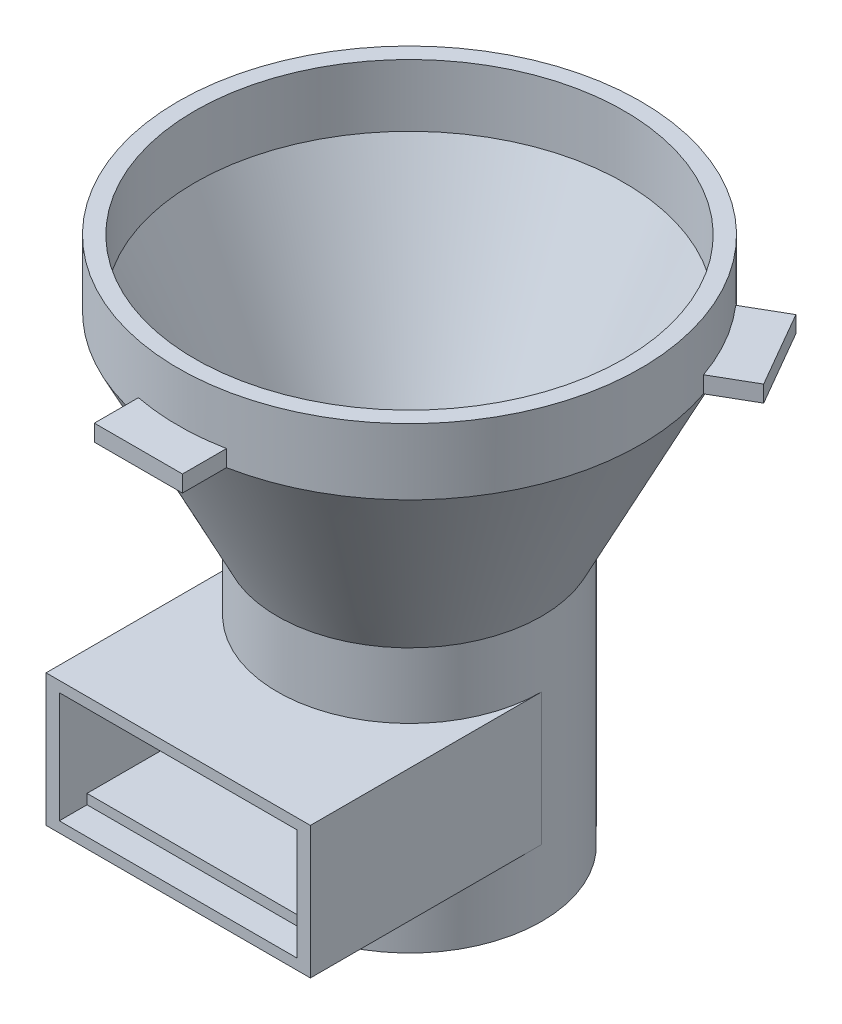
ISO-10303-21;
HEADER;
FILE_DESCRIPTION(('STEP AP214'),'2;1');
FILE_NAME('part.step','',(''),(''),'','','');
FILE_SCHEMA(('AUTOMOTIVE_DESIGN { 1 0 10303 214 1 1 1 1 }'));
ENDSEC;
DATA;
#1=APPLICATION_CONTEXT('core data for automotive mechanical design processes');
#2=APPLICATION_PROTOCOL_DEFINITION('international standard','automotive_design',2000,#1);
#3=PRODUCT_CONTEXT('',#1,'mechanical');
#4=PRODUCT('Part','Part','',(#3));
#5=PRODUCT_RELATED_PRODUCT_CATEGORY('part','',(#4));
#6=PRODUCT_DEFINITION_FORMATION('','',#4);
#7=PRODUCT_DEFINITION_CONTEXT('part definition',#1,'design');
#8=PRODUCT_DEFINITION('design','',#6,#7);
#9=PRODUCT_DEFINITION_SHAPE('','',#8);
#10=(LENGTH_UNIT() NAMED_UNIT(*) SI_UNIT(.MILLI.,.METRE.));
#11=(NAMED_UNIT(*) PLANE_ANGLE_UNIT() SI_UNIT($,.RADIAN.));
#12=(NAMED_UNIT(*) SI_UNIT($,.STERADIAN.) SOLID_ANGLE_UNIT());
#13=UNCERTAINTY_MEASURE_WITH_UNIT(LENGTH_MEASURE(1.E-05),#10,'distance_accuracy_value','');
#14=(GEOMETRIC_REPRESENTATION_CONTEXT(3) GLOBAL_UNCERTAINTY_ASSIGNED_CONTEXT((#13)) GLOBAL_UNIT_ASSIGNED_CONTEXT((#10,
#11,#12)) REPRESENTATION_CONTEXT('',''));
#15=CARTESIAN_POINT('',(0.,0.,0.));
#16=DIRECTION('',(0.,0.,1.));
#17=DIRECTION('',(1.,0.,0.));
#18=AXIS2_PLACEMENT_3D('',#15,#16,#17);
#19=CARTESIAN_POINT('',(0.,92.075,0.));
#20=DIRECTION('',(0.,-1.,0.));
#21=DIRECTION('',(1.,0.,0.));
#22=AXIS2_PLACEMENT_3D('',#19,#20,#21);
#23=PLANE('',#22);
#24=CARTESIAN_POINT('',(0.,92.075,0.));
#25=DIRECTION('',(0.,1.,0.));
#26=DIRECTION('',(-1.,0.,0.));
#27=AXIS2_PLACEMENT_3D('',#24,#25,#26);
#28=CIRCLE('',#27,44.45);
#29=CARTESIAN_POINT('',(-8.46666666666669,92.075,43.6362012044536));
#30=VERTEX_POINT('',#29);
#31=CARTESIAN_POINT('',(8.46666666666665,92.075,43.6362012044536));
#32=VERTEX_POINT('',#31);
#33=EDGE_CURVE('E51',#30,#32,#28,.T.);
#34=ORIENTED_EDGE('',*,*,#33,.F.);
#35=DIRECTION('',(0.,0.,1.));
#36=VECTOR('',#35,1.);
#37=CARTESIAN_POINT('',(-8.46666666666669,92.075,52.1028678711202));
#38=LINE('',#37,#36);
#39=CARTESIAN_POINT('',(-8.46666666666669,92.075,52.1028678711202));
#40=VERTEX_POINT('',#39);
#41=EDGE_CURVE('E205',#30,#40,#38,.T.);
#42=ORIENTED_EDGE('',*,*,#41,.T.);
#43=DIRECTION('',(1.,0.,0.));
#44=VECTOR('',#43,1.);
#45=CARTESIAN_POINT('',(0.,92.075,52.1028678711202));
#46=LINE('',#45,#44);
#47=CARTESIAN_POINT('',(8.46666666666665,92.075,52.1028678711202));
#48=VERTEX_POINT('',#47);
#49=EDGE_CURVE('E223',#40,#48,#46,.T.);
#50=ORIENTED_EDGE('',*,*,#49,.T.);
#51=DIRECTION('',(0.,0.,-1.));
#52=VECTOR('',#51,1.);
#53=CARTESIAN_POINT('',(8.46666666666665,92.075,52.1028678711202));
#54=LINE('',#53,#52);
#55=EDGE_CURVE('E208',#48,#32,#54,.T.);
#56=ORIENTED_EDGE('',*,*,#55,.T.);
#57=EDGE_LOOP('',(#34,#42,#50,#56));
#58=FACE_BOUND('',#57,.T.);
#59=ADVANCED_FACE('F41',(#58),#23,.F.);
#60=CARTESIAN_POINT('',(42.0233921010393,92.075,-14.4857521835181));
#61=VERTEX_POINT('',#60);
#62=CARTESIAN_POINT('',(33.5567254343728,92.075,-29.1504490209347));
#63=VERTEX_POINT('',#62);
#64=EDGE_CURVE('E11',#61,#63,#28,.T.);
#65=ORIENTED_EDGE('',*,*,#64,.F.);
#66=DIRECTION('',(0.866025403784443,0.,-0.499999999999992));
#67=VECTOR('',#66,1.);
#68=CARTESIAN_POINT('',(49.3557405197476,92.075,-18.7190855168514));
#69=LINE('',#68,#67);
#70=CARTESIAN_POINT('',(49.3557405197476,92.075,-18.7190855168514));
#71=VERTEX_POINT('',#70);
#72=EDGE_CURVE('E369',#61,#71,#69,.T.);
#73=ORIENTED_EDGE('',*,*,#72,.T.);
#74=DIRECTION('',(-0.499999999999992,0.,-0.866025403784443));
#75=VECTOR('',#74,1.);
#76=CARTESIAN_POINT('',(45.1224071864144,92.075,-26.0514339355597));
#77=LINE('',#76,#75);
#78=CARTESIAN_POINT('',(40.8890738530811,92.075,-33.383782354268));
#79=VERTEX_POINT('',#78);
#80=EDGE_CURVE('E357',#71,#79,#77,.T.);
#81=ORIENTED_EDGE('',*,*,#80,.T.);
#82=DIRECTION('',(-0.866025403784443,0.,0.499999999999992));
#83=VECTOR('',#82,1.);
#84=CARTESIAN_POINT('',(40.8890738530811,92.075,-33.383782354268));
#85=LINE('',#84,#83);
#86=EDGE_CURVE('E352',#79,#63,#85,.T.);
#87=ORIENTED_EDGE('',*,*,#86,.T.);
#88=EDGE_LOOP('',(#65,#73,#81,#87));
#89=FACE_BOUND('',#88,.T.);
#90=ADVANCED_FACE('F441',(#89),#23,.F.);
#91=CARTESIAN_POINT('',(-33.5567254343724,92.075,-29.1504490209352));
#92=VERTEX_POINT('',#91);
#93=CARTESIAN_POINT('',(-42.0233921010392,92.075,-14.4857521835187));
#94=VERTEX_POINT('',#93);
#95=EDGE_CURVE('E49',#92,#94,#28,.T.);
#96=ORIENTED_EDGE('',*,*,#95,.F.);
#97=DIRECTION('',(-0.866025403784436,0.,-0.500000000000004));
#98=VECTOR('',#97,1.);
#99=CARTESIAN_POINT('',(-40.8890738530807,92.075,-33.3837823542686));
#100=LINE('',#99,#98);
#101=CARTESIAN_POINT('',(-40.8890738530807,92.075,-33.3837823542686));
#102=VERTEX_POINT('',#101);
#103=EDGE_CURVE('E400',#92,#102,#100,.T.);
#104=ORIENTED_EDGE('',*,*,#103,.T.);
#105=DIRECTION('',(-0.500000000000004,0.,0.866025403784436));
#106=VECTOR('',#105,1.);
#107=CARTESIAN_POINT('',(-45.122407186414,92.075,-26.0514339355603));
#108=LINE('',#107,#106);
#109=CARTESIAN_POINT('',(-49.3557405197474,92.075,-18.7190855168521));
#110=VERTEX_POINT('',#109);
#111=EDGE_CURVE('E388',#102,#110,#108,.T.);
#112=ORIENTED_EDGE('',*,*,#111,.T.);
#113=DIRECTION('',(0.866025403784436,0.,0.500000000000004));
#114=VECTOR('',#113,1.);
#115=CARTESIAN_POINT('',(-49.3557405197474,92.075,-18.7190855168521));
#116=LINE('',#115,#114);
#117=EDGE_CURVE('E375',#110,#94,#116,.T.);
#118=ORIENTED_EDGE('',*,*,#117,.T.);
#119=EDGE_LOOP('',(#96,#104,#112,#118));
#120=FACE_BOUND('',#119,.T.);
#121=ADVANCED_FACE('F461',(#120),#23,.F.);
#122=CARTESIAN_POINT('',(22.86,14.8525001339576,3.68300000000003));
#123=DIRECTION('',(1.,0.,0.));
#124=DIRECTION('',(0.,0.,-1.));
#125=AXIS2_PLACEMENT_3D('',#122,#123,#124);
#126=PLANE('',#125);
#127=DIRECTION('',(0.,0.,1.));
#128=VECTOR('',#127,1.);
#129=CARTESIAN_POINT('',(22.86,16.7575001339576,3.68300000000003));
#130=LINE('',#129,#128);
#131=CARTESIAN_POINT('',(22.86,16.7575001339576,3.68300000000003));
#132=VERTEX_POINT('',#131);
#133=CARTESIAN_POINT('',(22.86,16.7575001339576,39.1163527750558));
#134=VERTEX_POINT('',#133);
#135=EDGE_CURVE('E290',#132,#134,#130,.T.);
#136=ORIENTED_EDGE('',*,*,#135,.T.);
#137=DIRECTION('',(0.,1.,0.));
#138=VECTOR('',#137,1.);
#139=CARTESIAN_POINT('',(22.86,16.7575001339576,39.1163527750558));
#140=LINE('',#139,#138);
#141=CARTESIAN_POINT('',(22.86,14.8525001339576,39.1163527750558));
#142=VERTEX_POINT('',#141);
#143=EDGE_CURVE('E278',#142,#134,#140,.T.);
#144=ORIENTED_EDGE('',*,*,#143,.F.);
#145=DIRECTION('',(0.,0.,1.));
#146=VECTOR('',#145,1.);
#147=CARTESIAN_POINT('',(22.86,14.8525001339576,3.68300000000003));
#148=LINE('',#147,#146);
#149=CARTESIAN_POINT('',(22.86,14.8525001339576,44.45));
#150=VERTEX_POINT('',#149);
#151=EDGE_CURVE('E310',#142,#150,#148,.T.);
#152=ORIENTED_EDGE('',*,*,#151,.T.);
#153=DIRECTION('',(0.,1.,0.));
#154=VECTOR('',#153,1.);
#155=CARTESIAN_POINT('',(22.86,14.8525001339576,44.45));
#156=LINE('',#155,#154);
#157=CARTESIAN_POINT('',(22.86,36.1885001339576,44.45));
#158=VERTEX_POINT('',#157);
#159=EDGE_CURVE('E66',#150,#158,#156,.T.);
#160=ORIENTED_EDGE('',*,*,#159,.T.);
#161=DIRECTION('',(0.,0.,1.));
#162=VECTOR('',#161,1.);
#163=CARTESIAN_POINT('',(22.86,36.1885001339576,3.68300000000003));
#164=LINE('',#163,#162);
#165=CARTESIAN_POINT('',(22.86,36.1885001339576,3.68300000000003));
#166=VERTEX_POINT('',#165);
#167=EDGE_CURVE('E300',#166,#158,#164,.T.);
#168=ORIENTED_EDGE('',*,*,#167,.F.);
#169=DIRECTION('',(0.,1.,0.));
#170=VECTOR('',#169,1.);
#171=CARTESIAN_POINT('',(22.86,14.8525001339576,3.68300000000003));
#172=LINE('',#171,#170);
#173=EDGE_CURVE('E292',#132,#166,#172,.T.);
#174=ORIENTED_EDGE('',*,*,#173,.F.);
#175=EDGE_LOOP('',(#136,#144,#152,#160,#168,#174));
#176=FACE_BOUND('',#175,.T.);
#177=ADVANCED_FACE('F466',(#176),#126,.F.);
#178=CARTESIAN_POINT('',(-22.86,14.8525001339576,3.68300000000003));
#179=DIRECTION('',(-1.,0.,0.));
#180=DIRECTION('',(0.,0.,1.));
#181=AXIS2_PLACEMENT_3D('',#178,#179,#180);
#182=PLANE('',#181);
#183=DIRECTION('',(0.,-1.,0.));
#184=VECTOR('',#183,1.);
#185=CARTESIAN_POINT('',(-22.86,16.7575001339576,39.1163527750558));
#186=LINE('',#185,#184);
#187=CARTESIAN_POINT('',(-22.86,16.7575001339576,39.1163527750558));
#188=VERTEX_POINT('',#187);
#189=CARTESIAN_POINT('',(-22.86,14.8525001339576,39.1163527750558));
#190=VERTEX_POINT('',#189);
#191=EDGE_CURVE('E274',#188,#190,#186,.T.);
#192=ORIENTED_EDGE('',*,*,#191,.F.);
#193=DIRECTION('',(0.,0.,-1.));
#194=VECTOR('',#193,1.);
#195=CARTESIAN_POINT('',(-22.86,16.7575001339576,3.68300000000003));
#196=LINE('',#195,#194);
#197=CARTESIAN_POINT('',(-22.86,16.7575001339576,3.68300000000003));
#198=VERTEX_POINT('',#197);
#199=EDGE_CURVE('E287',#188,#198,#196,.T.);
#200=ORIENTED_EDGE('',*,*,#199,.T.);
#201=DIRECTION('',(0.,-1.,0.));
#202=VECTOR('',#201,1.);
#203=CARTESIAN_POINT('',(-22.86,14.8525001339576,3.68300000000003));
#204=LINE('',#203,#202);
#205=CARTESIAN_POINT('',(-22.86,36.1885001339576,3.68300000000003));
#206=VERTEX_POINT('',#205);
#207=EDGE_CURVE('E298',#206,#198,#204,.T.);
#208=ORIENTED_EDGE('',*,*,#207,.F.);
#209=DIRECTION('',(0.,0.,1.));
#210=VECTOR('',#209,1.);
#211=CARTESIAN_POINT('',(-22.86,36.1885001339576,3.68300000000003));
#212=LINE('',#211,#210);
#213=CARTESIAN_POINT('',(-22.86,36.1885001339576,44.45));
#214=VERTEX_POINT('',#213);
#215=EDGE_CURVE('E315',#206,#214,#212,.T.);
#216=ORIENTED_EDGE('',*,*,#215,.T.);
#217=DIRECTION('',(0.,-1.,0.));
#218=VECTOR('',#217,1.);
#219=CARTESIAN_POINT('',(-22.86,14.8525001339576,44.45));
#220=LINE('',#219,#218);
#221=CARTESIAN_POINT('',(-22.86,14.8525001339576,44.45));
#222=VERTEX_POINT('',#221);
#223=EDGE_CURVE('E305',#214,#222,#220,.T.);
#224=ORIENTED_EDGE('',*,*,#223,.T.);
#225=DIRECTION('',(0.,0.,1.));
#226=VECTOR('',#225,1.);
#227=CARTESIAN_POINT('',(-22.86,14.8525001339576,3.68300000000003));
#228=LINE('',#227,#226);
#229=EDGE_CURVE('E313',#190,#222,#228,.T.);
#230=ORIENTED_EDGE('',*,*,#229,.F.);
#231=EDGE_LOOP('',(#192,#200,#208,#216,#224,#230));
#232=FACE_BOUND('',#231,.T.);
#233=ADVANCED_FACE('F471',(#232),#182,.F.);
#234=CARTESIAN_POINT('',(-22.86,14.8525001339576,3.68300000000003));
#235=DIRECTION('',(0.,-1.,0.));
#236=DIRECTION('',(0.,0.,-1.));
#237=AXIS2_PLACEMENT_3D('',#234,#235,#236);
#238=PLANE('',#237);
#239=ORIENTED_EDGE('',*,*,#151,.F.);
#240=DIRECTION('',(1.,0.,0.));
#241=VECTOR('',#240,1.);
#242=CARTESIAN_POINT('',(-22.86,14.8525001339576,39.1163527750558));
#243=LINE('',#242,#241);
#244=EDGE_CURVE('E276',#190,#142,#243,.T.);
#245=ORIENTED_EDGE('',*,*,#244,.F.);
#246=ORIENTED_EDGE('',*,*,#229,.T.);
#247=DIRECTION('',(1.,0.,0.));
#248=VECTOR('',#247,1.);
#249=CARTESIAN_POINT('',(-22.86,14.8525001339576,44.45));
#250=LINE('',#249,#248);
#251=EDGE_CURVE('E295',#222,#150,#250,.T.);
#252=ORIENTED_EDGE('',*,*,#251,.T.);
#253=EDGE_LOOP('',(#239,#245,#246,#252));
#254=FACE_BOUND('',#253,.T.);
#255=ADVANCED_FACE('F520',(#254),#238,.F.);
#256=CARTESIAN_POINT('',(0.,0.,0.));
#257=DIRECTION('',(0.,-1.,0.));
#258=DIRECTION('',(1.,0.,0.));
#259=AXIS2_PLACEMENT_3D('',#256,#257,#258);
#260=CYLINDRICAL_SURFACE('',#259,25.4);
#261=CARTESIAN_POINT('',(0.,50.8,0.));
#262=DIRECTION('',(0.,-1.,0.));
#263=DIRECTION('',(1.,0.,0.));
#264=AXIS2_PLACEMENT_3D('',#261,#262,#263);
#265=CIRCLE('',#264,25.4);
#266=CARTESIAN_POINT('',(25.4,50.8,0.));
#267=VERTEX_POINT('',#266);
#268=EDGE_CURVE('E253',#267,#267,#265,.T.);
#269=ORIENTED_EDGE('',*,*,#268,.T.);
#270=EDGE_LOOP('',(#269));
#271=FACE_BOUND('',#270,.T.);
#272=CARTESIAN_POINT('',(0.,0.,0.));
#273=DIRECTION('',(0.,-1.,0.));
#274=DIRECTION('',(1.,0.,0.));
#275=AXIS2_PLACEMENT_3D('',#272,#273,#274);
#276=CIRCLE('',#275,25.4);
#277=CARTESIAN_POINT('',(25.4,0.,0.));
#278=VERTEX_POINT('',#277);
#279=EDGE_CURVE('E245',#278,#278,#276,.T.);
#280=ORIENTED_EDGE('',*,*,#279,.F.);
#281=EDGE_LOOP('',(#280));
#282=FACE_BOUND('',#281,.T.);
#283=CARTESIAN_POINT('',(0.,12.8205001339576,0.));
#284=DIRECTION('',(0.,1.,0.));
#285=DIRECTION('',(0.,0.,1.));
#286=AXIS2_PLACEMENT_3D('',#283,#284,#285);
#287=CIRCLE('',#286,25.4);
#288=CARTESIAN_POINT('',(-25.4,12.8205001339576,0.));
#289=VERTEX_POINT('',#288);
#290=CARTESIAN_POINT('',(25.4,12.8205001339576,0.));
#291=VERTEX_POINT('',#290);
#292=EDGE_CURVE('E349',#289,#291,#287,.T.);
#293=ORIENTED_EDGE('',*,*,#292,.F.);
#294=DIRECTION('',(0.,-1.,0.));
#295=VECTOR('',#294,1.);
#296=CARTESIAN_POINT('',(-25.4,38.2205001339576,0.));
#297=LINE('',#296,#295);
#298=CARTESIAN_POINT('',(-25.4,38.2205001339576,0.));
#299=VERTEX_POINT('',#298);
#300=EDGE_CURVE('E319',#299,#289,#297,.T.);
#301=ORIENTED_EDGE('',*,*,#300,.F.);
#302=CARTESIAN_POINT('',(0.,38.2205001339576,0.));
#303=DIRECTION('',(0.,-1.,0.));
#304=DIRECTION('',(0.,0.,-1.));
#305=AXIS2_PLACEMENT_3D('',#302,#303,#304);
#306=CIRCLE('',#305,25.4);
#307=CARTESIAN_POINT('',(25.4,38.2205001339576,0.));
#308=VERTEX_POINT('',#307);
#309=EDGE_CURVE('E346',#308,#299,#306,.T.);
#310=ORIENTED_EDGE('',*,*,#309,.F.);
#311=DIRECTION('',(0.,1.,0.));
#312=VECTOR('',#311,1.);
#313=CARTESIAN_POINT('',(25.4,38.2205001339576,0.));
#314=LINE('',#313,#312);
#315=EDGE_CURVE('E324',#291,#308,#314,.T.);
#316=ORIENTED_EDGE('',*,*,#315,.F.);
#317=EDGE_LOOP('',(#293,#301,#310,#316));
#318=FACE_BOUND('',#317,.T.);
#319=ADVANCED_FACE('F513',(#271,#282,#318),#260,.T.);
#320=CARTESIAN_POINT('',(0.,0.,0.));
#321=DIRECTION('',(0.,-1.,0.));
#322=DIRECTION('',(1.,0.,0.));
#323=AXIS2_PLACEMENT_3D('',#320,#321,#322);
#324=CYLINDRICAL_SURFACE('',#323,22.225);
#325=DIRECTION('',(0.,-1.,0.));
#326=VECTOR('',#325,1.);
#327=CARTESIAN_POINT('',(-21.9177128368815,0.,3.68300000000003));
#328=LINE('',#327,#326);
#329=CARTESIAN_POINT('',(-21.9177128368815,16.7575001339576,3.68300000000003));
#330=VERTEX_POINT('',#329);
#331=CARTESIAN_POINT('',(-21.9177128368815,36.1885001339576,3.68300000000003));
#332=VERTEX_POINT('',#331);
#333=EDGE_CURVE('E259',#330,#332,#328,.F.);
#334=ORIENTED_EDGE('',*,*,#333,.F.);
#335=CARTESIAN_POINT('',(0.,16.7575001339576,0.));
#336=DIRECTION('',(0.,-1.,0.));
#337=DIRECTION('',(0.,0.,1.));
#338=AXIS2_PLACEMENT_3D('',#335,#336,#337);
#339=CIRCLE('',#338,22.225);
#340=CARTESIAN_POINT('',(21.9177128368815,16.7575001339576,3.68300000000003));
#341=VERTEX_POINT('',#340);
#342=EDGE_CURVE('E58',#341,#330,#339,.T.);
#343=ORIENTED_EDGE('',*,*,#342,.F.);
#344=DIRECTION('',(0.,-1.,0.));
#345=VECTOR('',#344,1.);
#346=CARTESIAN_POINT('',(21.9177128368815,0.,3.68300000000003));
#347=LINE('',#346,#345);
#348=CARTESIAN_POINT('',(21.9177128368815,36.1885001339576,3.68300000000003));
#349=VERTEX_POINT('',#348);
#350=EDGE_CURVE('E260',#349,#341,#347,.T.);
#351=ORIENTED_EDGE('',*,*,#350,.F.);
#352=CARTESIAN_POINT('',(0.,36.1885001339576,0.));
#353=DIRECTION('',(0.,1.,0.));
#354=DIRECTION('',(0.,0.,1.));
#355=AXIS2_PLACEMENT_3D('',#352,#353,#354);
#356=CIRCLE('',#355,22.225);
#357=EDGE_CURVE('E312',#332,#349,#356,.T.);
#358=ORIENTED_EDGE('',*,*,#357,.F.);
#359=EDGE_LOOP('',(#334,#343,#351,#358));
#360=FACE_BOUND('',#359,.T.);
#361=CARTESIAN_POINT('',(0.,0.,0.));
#362=DIRECTION('',(0.,1.,0.));
#363=DIRECTION('',(-1.,0.,0.));
#364=AXIS2_PLACEMENT_3D('',#361,#362,#363);
#365=CIRCLE('',#364,22.225);
#366=CARTESIAN_POINT('',(-22.225,0.,0.));
#367=VERTEX_POINT('',#366);
#368=EDGE_CURVE('E233',#367,#367,#365,.F.);
#369=ORIENTED_EDGE('',*,*,#368,.T.);
#370=EDGE_LOOP('',(#369));
#371=FACE_BOUND('',#370,.T.);
#372=CARTESIAN_POINT('',(0.,51.5495158285619,0.));
#373=DIRECTION('',(0.,1.,0.));
#374=DIRECTION('',(-1.,0.,0.));
#375=AXIS2_PLACEMENT_3D('',#372,#373,#374);
#376=CIRCLE('',#375,22.225);
#377=CARTESIAN_POINT('',(-22.225,51.5495158285618,0.));
#378=VERTEX_POINT('',#377);
#379=EDGE_CURVE('E246',#378,#378,#376,.F.);
#380=ORIENTED_EDGE('',*,*,#379,.F.);
#381=EDGE_LOOP('',(#380));
#382=FACE_BOUND('',#381,.T.);
#383=ADVANCED_FACE('F510',(#360,#371,#382),#324,.F.);
#384=CARTESIAN_POINT('',(0.,0.,0.));
#385=DIRECTION('',(0.,-1.,0.));
#386=DIRECTION('',(1.,0.,0.));
#387=AXIS2_PLACEMENT_3D('',#384,#385,#386);
#388=CYLINDRICAL_SURFACE('',#387,44.45);
#389=DIRECTION('',(0.,1.,0.));
#390=VECTOR('',#389,1.);
#391=CARTESIAN_POINT('',(-8.46666666666669,88.9,43.6362012044535));
#392=LINE('',#391,#390);
#393=CARTESIAN_POINT('',(-8.46666666666668,88.9,43.6362012044536));
#394=VERTEX_POINT('',#393);
#395=EDGE_CURVE('E219',#394,#30,#392,.T.);
#396=ORIENTED_EDGE('',*,*,#395,.T.);
#397=ORIENTED_EDGE('',*,*,#33,.T.);
#398=DIRECTION('',(0.,1.,0.));
#399=VECTOR('',#398,1.);
#400=CARTESIAN_POINT('',(8.46666666666665,88.9,43.6362012044535));
#401=LINE('',#400,#399);
#402=CARTESIAN_POINT('',(8.46666666666665,88.9,43.6362012044535));
#403=VERTEX_POINT('',#402);
#404=EDGE_CURVE('E231',#403,#32,#401,.T.);
#405=ORIENTED_EDGE('',*,*,#404,.F.);
#406=CARTESIAN_POINT('',(0.,88.9,0.));
#407=DIRECTION('',(0.,-1.,0.));
#408=DIRECTION('',(1.,0.,0.));
#409=AXIS2_PLACEMENT_3D('',#406,#407,#408);
#410=CIRCLE('',#409,44.45);
#411=CARTESIAN_POINT('',(42.0233921010393,88.9,-14.4857521835181));
#412=VERTEX_POINT('',#411);
#413=EDGE_CURVE('E256',#412,#403,#410,.T.);
#414=ORIENTED_EDGE('',*,*,#413,.F.);
#415=DIRECTION('',(0.,1.,0.));
#416=VECTOR('',#415,1.);
#417=CARTESIAN_POINT('',(42.0233921010393,88.9,-14.4857521835181));
#418=LINE('',#417,#416);
#419=EDGE_CURVE('E376',#412,#61,#418,.T.);
#420=ORIENTED_EDGE('',*,*,#419,.T.);
#421=ORIENTED_EDGE('',*,*,#64,.T.);
#422=DIRECTION('',(0.,1.,0.));
#423=VECTOR('',#422,1.);
#424=CARTESIAN_POINT('',(33.5567254343728,88.9,-29.1504490209347));
#425=LINE('',#424,#423);
#426=CARTESIAN_POINT('',(33.5567254343728,88.9,-29.1504490209347));
#427=VERTEX_POINT('',#426);
#428=EDGE_CURVE('E379',#427,#63,#425,.T.);
#429=ORIENTED_EDGE('',*,*,#428,.F.);
#430=CARTESIAN_POINT('',(-33.5567254343724,88.9,-29.1504490209352));
#431=VERTEX_POINT('',#430);
#432=EDGE_CURVE('E428',#431,#427,#410,.T.);
#433=ORIENTED_EDGE('',*,*,#432,.F.);
#434=DIRECTION('',(0.,1.,0.));
#435=VECTOR('',#434,1.);
#436=CARTESIAN_POINT('',(-33.5567254343725,88.9,-29.1504490209352));
#437=LINE('',#436,#435);
#438=EDGE_CURVE('E406',#431,#92,#437,.T.);
#439=ORIENTED_EDGE('',*,*,#438,.T.);
#440=ORIENTED_EDGE('',*,*,#95,.T.);
#441=DIRECTION('',(0.,1.,0.));
#442=VECTOR('',#441,1.);
#443=CARTESIAN_POINT('',(-42.0233921010392,88.9,-14.4857521835187));
#444=LINE('',#443,#442);
#445=CARTESIAN_POINT('',(-42.0233921010392,88.9,-14.4857521835187));
#446=VERTEX_POINT('',#445);
#447=EDGE_CURVE('E408',#446,#94,#444,.T.);
#448=ORIENTED_EDGE('',*,*,#447,.F.);
#449=EDGE_CURVE('E229',#394,#446,#410,.T.);
#450=ORIENTED_EDGE('',*,*,#449,.F.);
#451=EDGE_LOOP('',(#396,#397,#405,#414,#420,#421,#429,#433,#439,#440,#448,#450));
#452=FACE_BOUND('',#451,.T.);
#453=CARTESIAN_POINT('',(0.,101.6,0.));
#454=DIRECTION('',(0.,1.,0.));
#455=DIRECTION('',(-1.,0.,0.));
#456=AXIS2_PLACEMENT_3D('',#453,#454,#455);
#457=CIRCLE('',#456,44.45);
#458=CARTESIAN_POINT('',(-44.45,101.6,0.));
#459=VERTEX_POINT('',#458);
#460=EDGE_CURVE('E213',#459,#459,#457,.T.);
#461=ORIENTED_EDGE('',*,*,#460,.F.);
#462=EDGE_LOOP('',(#461));
#463=FACE_BOUND('',#462,.T.);
#464=ADVANCED_FACE('F225',(#452,#463),#388,.T.);
#465=CARTESIAN_POINT('',(0.,88.9,0.));
#466=DIRECTION('',(0.,1.,0.));
#467=DIRECTION('',(-1.,0.,0.));
#468=AXIS2_PLACEMENT_3D('',#465,#466,#467);
#469=CONICAL_SURFACE('',#468,44.45,0.463647609000806);
#470=ORIENTED_EDGE('',*,*,#268,.F.);
#471=EDGE_LOOP('',(#470));
#472=FACE_BOUND('',#471,.T.);
#473=EDGE_CURVE('E257',#403,#394,#410,.T.);
#474=ORIENTED_EDGE('',*,*,#473,.T.);
#475=ORIENTED_EDGE('',*,*,#449,.T.);
#476=CARTESIAN_POINT('',(0.,88.9,0.));
#477=DIRECTION('',(0.,-1.,0.));
#478=DIRECTION('',(0.500000000000004,0.,-0.866025403784436));
#479=AXIS2_PLACEMENT_3D('',#476,#477,#478);
#480=CIRCLE('',#479,44.45);
#481=EDGE_CURVE('E391',#446,#431,#480,.T.);
#482=ORIENTED_EDGE('',*,*,#481,.T.);
#483=ORIENTED_EDGE('',*,*,#432,.T.);
#484=CARTESIAN_POINT('',(0.,88.9,0.));
#485=DIRECTION('',(0.,-1.,0.));
#486=DIRECTION('',(0.499999999999992,0.,0.866025403784443));
#487=AXIS2_PLACEMENT_3D('',#484,#485,#486);
#488=CIRCLE('',#487,44.45);
#489=EDGE_CURVE('E360',#427,#412,#488,.T.);
#490=ORIENTED_EDGE('',*,*,#489,.T.);
#491=ORIENTED_EDGE('',*,*,#413,.T.);
#492=EDGE_LOOP('',(#474,#475,#482,#483,#490,#491));
#493=FACE_BOUND('',#492,.T.);
#494=ADVANCED_FACE('F430',(#472,#493),#469,.T.);
#495=CARTESIAN_POINT('',(-25.4,0.,0.));
#496=DIRECTION('',(0.,1.,0.));
#497=DIRECTION('',(-1.,0.,0.));
#498=AXIS2_PLACEMENT_3D('',#495,#496,#497);
#499=PLANE('',#498);
#500=ORIENTED_EDGE('',*,*,#368,.F.);
#501=EDGE_LOOP('',(#500));
#502=FACE_BOUND('',#501,.T.);
#503=ORIENTED_EDGE('',*,*,#279,.T.);
#504=EDGE_LOOP('',(#503));
#505=FACE_BOUND('',#504,.T.);
#506=ADVANCED_FACE('F505',(#502,#505),#499,.F.);
#507=CARTESIAN_POINT('',(0.,0.,0.));
#508=DIRECTION('',(0.,-1.,0.));
#509=DIRECTION('',(1.,0.,0.));
#510=AXIS2_PLACEMENT_3D('',#507,#508,#509);
#511=CYLINDRICAL_SURFACE('',#510,41.275);
#512=CARTESIAN_POINT('',(0.,89.6495158285618,0.));
#513=DIRECTION('',(0.,1.,0.));
#514=DIRECTION('',(-1.,0.,0.));
#515=AXIS2_PLACEMENT_3D('',#512,#513,#514);
#516=CIRCLE('',#515,41.275);
#517=CARTESIAN_POINT('',(-41.275,89.6495158285618,0.));
#518=VERTEX_POINT('',#517);
#519=EDGE_CURVE('E242',#518,#518,#516,.F.);
#520=ORIENTED_EDGE('',*,*,#519,.T.);
#521=EDGE_LOOP('',(#520));
#522=FACE_BOUND('',#521,.T.);
#523=CARTESIAN_POINT('',(0.,101.6,0.));
#524=DIRECTION('',(0.,1.,0.));
#525=DIRECTION('',(-1.,0.,0.));
#526=AXIS2_PLACEMENT_3D('',#523,#524,#525);
#527=CIRCLE('',#526,41.275);
#528=CARTESIAN_POINT('',(-41.275,101.6,0.));
#529=VERTEX_POINT('',#528);
#530=EDGE_CURVE('E214',#529,#529,#527,.T.);
#531=ORIENTED_EDGE('',*,*,#530,.T.);
#532=EDGE_LOOP('',(#531));
#533=FACE_BOUND('',#532,.T.);
#534=ADVANCED_FACE('F502',(#522,#533),#511,.F.);
#535=CARTESIAN_POINT('',(0.,90.3199031657124,0.));
#536=DIRECTION('',(0.,1.,0.));
#537=DIRECTION('',(-1.,0.,0.));
#538=AXIS2_PLACEMENT_3D('',#535,#536,#537);
#539=CONICAL_SURFACE('',#538,41.6101936685752,0.463647609000806);
#540=ORIENTED_EDGE('',*,*,#379,.T.);
#541=EDGE_LOOP('',(#540));
#542=FACE_BOUND('',#541,.T.);
#543=ORIENTED_EDGE('',*,*,#519,.F.);
#544=EDGE_LOOP('',(#543));
#545=FACE_BOUND('',#544,.T.);
#546=ADVANCED_FACE('F499',(#542,#545),#539,.F.);
#547=CARTESIAN_POINT('',(0.,88.9,52.1028678711202));
#548=DIRECTION('',(0.,0.,1.));
#549=DIRECTION('',(1.,0.,0.));
#550=AXIS2_PLACEMENT_3D('',#547,#548,#549);
#551=PLANE('',#550);
#552=ORIENTED_EDGE('',*,*,#49,.F.);
#553=DIRECTION('',(0.,1.,0.));
#554=VECTOR('',#553,1.);
#555=CARTESIAN_POINT('',(-8.46666666666669,88.9,52.1028678711202));
#556=LINE('',#555,#554);
#557=CARTESIAN_POINT('',(-8.46666666666669,88.9,52.1028678711202));
#558=VERTEX_POINT('',#557);
#559=EDGE_CURVE('E222',#558,#40,#556,.T.);
#560=ORIENTED_EDGE('',*,*,#559,.F.);
#561=DIRECTION('',(1.,0.,0.));
#562=VECTOR('',#561,1.);
#563=CARTESIAN_POINT('',(0.,88.9,52.1028678711202));
#564=LINE('',#563,#562);
#565=CARTESIAN_POINT('',(8.46666666666665,88.9,52.1028678711202));
#566=VERTEX_POINT('',#565);
#567=EDGE_CURVE('E412',#558,#566,#564,.T.);
#568=ORIENTED_EDGE('',*,*,#567,.T.);
#569=DIRECTION('',(0.,1.,0.));
#570=VECTOR('',#569,1.);
#571=CARTESIAN_POINT('',(8.46666666666665,88.9,52.1028678711202));
#572=LINE('',#571,#570);
#573=EDGE_CURVE('E235',#566,#48,#572,.T.);
#574=ORIENTED_EDGE('',*,*,#573,.T.);
#575=EDGE_LOOP('',(#552,#560,#568,#574));
#576=FACE_BOUND('',#575,.T.);
#577=ADVANCED_FACE('F420',(#576),#551,.T.);
#578=CARTESIAN_POINT('',(-8.46666666666669,88.9,52.1028678711202));
#579=DIRECTION('',(-1.,0.,0.));
#580=DIRECTION('',(0.,-1.,0.));
#581=AXIS2_PLACEMENT_3D('',#578,#579,#580);
#582=PLANE('',#581);
#583=ORIENTED_EDGE('',*,*,#41,.F.);
#584=ORIENTED_EDGE('',*,*,#395,.F.);
#585=DIRECTION('',(0.,0.,1.));
#586=VECTOR('',#585,1.);
#587=CARTESIAN_POINT('',(-8.46666666666669,88.9,52.1028678711202));
#588=LINE('',#587,#586);
#589=EDGE_CURVE('E241',#394,#558,#588,.T.);
#590=ORIENTED_EDGE('',*,*,#589,.T.);
#591=ORIENTED_EDGE('',*,*,#559,.T.);
#592=EDGE_LOOP('',(#583,#584,#590,#591));
#593=FACE_BOUND('',#592,.T.);
#594=ADVANCED_FACE('F217',(#593),#582,.T.);
#595=CARTESIAN_POINT('',(8.46666666666665,88.9,52.1028678711202));
#596=DIRECTION('',(1.,0.,0.));
#597=DIRECTION('',(0.,1.,0.));
#598=AXIS2_PLACEMENT_3D('',#595,#596,#597);
#599=PLANE('',#598);
#600=ORIENTED_EDGE('',*,*,#55,.F.);
#601=ORIENTED_EDGE('',*,*,#573,.F.);
#602=DIRECTION('',(0.,0.,-1.));
#603=VECTOR('',#602,1.);
#604=CARTESIAN_POINT('',(8.46666666666665,88.9,52.1028678711202));
#605=LINE('',#604,#603);
#606=EDGE_CURVE('E415',#566,#403,#605,.T.);
#607=ORIENTED_EDGE('',*,*,#606,.T.);
#608=ORIENTED_EDGE('',*,*,#404,.T.);
#609=EDGE_LOOP('',(#600,#601,#607,#608));
#610=FACE_BOUND('',#609,.T.);
#611=ADVANCED_FACE('F423',(#610),#599,.T.);
#612=CARTESIAN_POINT('',(0.,88.9,0.));
#613=DIRECTION('',(0.,1.,0.));
#614=DIRECTION('',(-1.,0.,0.));
#615=AXIS2_PLACEMENT_3D('',#612,#613,#614);
#616=PLANE('',#615);
#617=ORIENTED_EDGE('',*,*,#567,.F.);
#618=ORIENTED_EDGE('',*,*,#589,.F.);
#619=ORIENTED_EDGE('',*,*,#473,.F.);
#620=ORIENTED_EDGE('',*,*,#606,.F.);
#621=EDGE_LOOP('',(#617,#618,#619,#620));
#622=FACE_BOUND('',#621,.T.);
#623=ADVANCED_FACE('F485',(#622),#616,.F.);
#624=CARTESIAN_POINT('',(-45.122407186414,88.9,-26.0514339355603));
#625=DIRECTION('',(-0.866025403784436,0.,-0.500000000000004));
#626=DIRECTION('',(-0.500000000000004,0.,0.866025403784436));
#627=AXIS2_PLACEMENT_3D('',#624,#625,#626);
#628=PLANE('',#627);
#629=ORIENTED_EDGE('',*,*,#111,.F.);
#630=DIRECTION('',(0.,1.,0.));
#631=VECTOR('',#630,1.);
#632=CARTESIAN_POINT('',(-40.8890738530807,88.9,-33.3837823542686));
#633=LINE('',#632,#631);
#634=CARTESIAN_POINT('',(-40.8890738530807,88.9,-33.3837823542686));
#635=VERTEX_POINT('',#634);
#636=EDGE_CURVE('E404',#635,#102,#633,.T.);
#637=ORIENTED_EDGE('',*,*,#636,.F.);
#638=DIRECTION('',(-0.500000000000004,0.,0.866025403784436));
#639=VECTOR('',#638,1.);
#640=CARTESIAN_POINT('',(-45.122407186414,88.9,-26.0514339355603));
#641=LINE('',#640,#639);
#642=CARTESIAN_POINT('',(-49.3557405197474,88.9,-18.7190855168521));
#643=VERTEX_POINT('',#642);
#644=EDGE_CURVE('E384',#635,#643,#641,.T.);
#645=ORIENTED_EDGE('',*,*,#644,.T.);
#646=DIRECTION('',(0.,1.,0.));
#647=VECTOR('',#646,1.);
#648=CARTESIAN_POINT('',(-49.3557405197474,88.9,-18.7190855168521));
#649=LINE('',#648,#647);
#650=EDGE_CURVE('E397',#643,#110,#649,.T.);
#651=ORIENTED_EDGE('',*,*,#650,.T.);
#652=EDGE_LOOP('',(#629,#637,#645,#651));
#653=FACE_BOUND('',#652,.T.);
#654=ADVANCED_FACE('F481',(#653),#628,.T.);
#655=CARTESIAN_POINT('',(-40.8890738530807,88.9,-33.3837823542686));
#656=DIRECTION('',(0.500000000000004,0.,-0.866025403784436));
#657=DIRECTION('',(-0.866025403784436,0.,-0.500000000000004));
#658=AXIS2_PLACEMENT_3D('',#655,#656,#657);
#659=PLANE('',#658);
#660=ORIENTED_EDGE('',*,*,#103,.F.);
#661=ORIENTED_EDGE('',*,*,#438,.F.);
#662=DIRECTION('',(-0.866025403784436,0.,-0.500000000000004));
#663=VECTOR('',#662,1.);
#664=CARTESIAN_POINT('',(-40.8890738530807,88.9,-33.3837823542686));
#665=LINE('',#664,#663);
#666=EDGE_CURVE('E394',#431,#635,#665,.T.);
#667=ORIENTED_EDGE('',*,*,#666,.T.);
#668=ORIENTED_EDGE('',*,*,#636,.T.);
#669=EDGE_LOOP('',(#660,#661,#667,#668));
#670=FACE_BOUND('',#669,.T.);
#671=ADVANCED_FACE('F478',(#670),#659,.T.);
#672=CARTESIAN_POINT('',(-49.3557405197474,88.9,-18.7190855168521));
#673=DIRECTION('',(-0.500000000000004,0.,0.866025403784436));
#674=DIRECTION('',(0.866025403784436,0.,0.500000000000004));
#675=AXIS2_PLACEMENT_3D('',#672,#673,#674);
#676=PLANE('',#675);
#677=ORIENTED_EDGE('',*,*,#117,.F.);
#678=ORIENTED_EDGE('',*,*,#650,.F.);
#679=DIRECTION('',(0.866025403784436,0.,0.500000000000004));
#680=VECTOR('',#679,1.);
#681=CARTESIAN_POINT('',(-49.3557405197474,88.9,-18.7190855168521));
#682=LINE('',#681,#680);
#683=EDGE_CURVE('E387',#643,#446,#682,.T.);
#684=ORIENTED_EDGE('',*,*,#683,.T.);
#685=ORIENTED_EDGE('',*,*,#447,.T.);
#686=EDGE_LOOP('',(#677,#678,#684,#685));
#687=FACE_BOUND('',#686,.T.);
#688=ADVANCED_FACE('F456',(#687),#676,.T.);
#689=CARTESIAN_POINT('',(0.,88.9,0.));
#690=DIRECTION('',(0.,1.,0.));
#691=DIRECTION('',(0.500000000000004,0.,-0.866025403784436));
#692=AXIS2_PLACEMENT_3D('',#689,#690,#691);
#693=PLANE('',#692);
#694=ORIENTED_EDGE('',*,*,#644,.F.);
#695=ORIENTED_EDGE('',*,*,#666,.F.);
#696=ORIENTED_EDGE('',*,*,#481,.F.);
#697=ORIENTED_EDGE('',*,*,#683,.F.);
#698=EDGE_LOOP('',(#694,#695,#696,#697));
#699=FACE_BOUND('',#698,.T.);
#700=ADVANCED_FACE('F449',(#699),#693,.F.);
#701=CARTESIAN_POINT('',(45.1224071864144,88.9,-26.0514339355597));
#702=DIRECTION('',(0.866025403784443,0.,-0.499999999999992));
#703=DIRECTION('',(-0.499999999999992,0.,-0.866025403784443));
#704=AXIS2_PLACEMENT_3D('',#701,#702,#703);
#705=PLANE('',#704);
#706=ORIENTED_EDGE('',*,*,#80,.F.);
#707=DIRECTION('',(0.,1.,0.));
#708=VECTOR('',#707,1.);
#709=CARTESIAN_POINT('',(49.3557405197476,88.9,-18.7190855168514));
#710=LINE('',#709,#708);
#711=CARTESIAN_POINT('',(49.3557405197476,88.9,-18.7190855168514));
#712=VERTEX_POINT('',#711);
#713=EDGE_CURVE('E373',#712,#71,#710,.T.);
#714=ORIENTED_EDGE('',*,*,#713,.F.);
#715=DIRECTION('',(-0.499999999999992,0.,-0.866025403784443));
#716=VECTOR('',#715,1.);
#717=CARTESIAN_POINT('',(45.1224071864144,88.9,-26.0514339355597));
#718=LINE('',#717,#716);
#719=CARTESIAN_POINT('',(40.8890738530811,88.9,-33.383782354268));
#720=VERTEX_POINT('',#719);
#721=EDGE_CURVE('E353',#712,#720,#718,.T.);
#722=ORIENTED_EDGE('',*,*,#721,.T.);
#723=DIRECTION('',(0.,1.,0.));
#724=VECTOR('',#723,1.);
#725=CARTESIAN_POINT('',(40.8890738530811,88.9,-33.383782354268));
#726=LINE('',#725,#724);
#727=EDGE_CURVE('E366',#720,#79,#726,.T.);
#728=ORIENTED_EDGE('',*,*,#727,.T.);
#729=EDGE_LOOP('',(#706,#714,#722,#728));
#730=FACE_BOUND('',#729,.T.);
#731=ADVANCED_FACE('F447',(#730),#705,.T.);
#732=CARTESIAN_POINT('',(49.3557405197476,88.9,-18.7190855168514));
#733=DIRECTION('',(0.499999999999992,0.,0.866025403784443));
#734=DIRECTION('',(0.866025403784443,0.,-0.499999999999992));
#735=AXIS2_PLACEMENT_3D('',#732,#733,#734);
#736=PLANE('',#735);
#737=ORIENTED_EDGE('',*,*,#72,.F.);
#738=ORIENTED_EDGE('',*,*,#419,.F.);
#739=DIRECTION('',(0.866025403784443,0.,-0.499999999999992));
#740=VECTOR('',#739,1.);
#741=CARTESIAN_POINT('',(49.3557405197476,88.9,-18.7190855168514));
#742=LINE('',#741,#740);
#743=EDGE_CURVE('E363',#412,#712,#742,.T.);
#744=ORIENTED_EDGE('',*,*,#743,.T.);
#745=ORIENTED_EDGE('',*,*,#713,.T.);
#746=EDGE_LOOP('',(#737,#738,#744,#745));
#747=FACE_BOUND('',#746,.T.);
#748=ADVANCED_FACE('F444',(#747),#736,.T.);
#749=CARTESIAN_POINT('',(40.8890738530811,88.9,-33.383782354268));
#750=DIRECTION('',(-0.499999999999992,0.,-0.866025403784443));
#751=DIRECTION('',(-0.866025403784443,0.,0.499999999999992));
#752=AXIS2_PLACEMENT_3D('',#749,#750,#751);
#753=PLANE('',#752);
#754=ORIENTED_EDGE('',*,*,#86,.F.);
#755=ORIENTED_EDGE('',*,*,#727,.F.);
#756=DIRECTION('',(-0.866025403784443,0.,0.499999999999992));
#757=VECTOR('',#756,1.);
#758=CARTESIAN_POINT('',(40.8890738530811,88.9,-33.383782354268));
#759=LINE('',#758,#757);
#760=EDGE_CURVE('E356',#720,#427,#759,.T.);
#761=ORIENTED_EDGE('',*,*,#760,.T.);
#762=ORIENTED_EDGE('',*,*,#428,.T.);
#763=EDGE_LOOP('',(#754,#755,#761,#762));
#764=FACE_BOUND('',#763,.T.);
#765=ADVANCED_FACE('F438',(#764),#753,.T.);
#766=CARTESIAN_POINT('',(0.,88.9,0.));
#767=DIRECTION('',(0.,1.,0.));
#768=DIRECTION('',(0.499999999999992,0.,0.866025403784443));
#769=AXIS2_PLACEMENT_3D('',#766,#767,#768);
#770=PLANE('',#769);
#771=ORIENTED_EDGE('',*,*,#721,.F.);
#772=ORIENTED_EDGE('',*,*,#743,.F.);
#773=ORIENTED_EDGE('',*,*,#489,.F.);
#774=ORIENTED_EDGE('',*,*,#760,.F.);
#775=EDGE_LOOP('',(#771,#772,#773,#774));
#776=FACE_BOUND('',#775,.T.);
#777=ADVANCED_FACE('F434',(#776),#770,.F.);
#778=CARTESIAN_POINT('',(-25.4,38.2205001339576,44.45));
#779=DIRECTION('',(1.,0.,0.));
#780=DIRECTION('',(0.,0.,-1.));
#781=AXIS2_PLACEMENT_3D('',#778,#779,#780);
#782=PLANE('',#781);
#783=ORIENTED_EDGE('',*,*,#300,.T.);
#784=DIRECTION('',(0.,0.,-1.));
#785=VECTOR('',#784,1.);
#786=CARTESIAN_POINT('',(-25.4,12.8205001339576,44.45));
#787=LINE('',#786,#785);
#788=CARTESIAN_POINT('',(-25.4,12.8205001339576,44.45));
#789=VERTEX_POINT('',#788);
#790=EDGE_CURVE('E343',#789,#289,#787,.T.);
#791=ORIENTED_EDGE('',*,*,#790,.F.);
#792=DIRECTION('',(0.,-1.,0.));
#793=VECTOR('',#792,1.);
#794=CARTESIAN_POINT('',(-25.4,38.2205001339576,44.45));
#795=LINE('',#794,#793);
#796=CARTESIAN_POINT('',(-25.4,38.2205001339576,44.45));
#797=VERTEX_POINT('',#796);
#798=EDGE_CURVE('E320',#797,#789,#795,.T.);
#799=ORIENTED_EDGE('',*,*,#798,.F.);
#800=DIRECTION('',(0.,0.,-1.));
#801=VECTOR('',#800,1.);
#802=CARTESIAN_POINT('',(-25.4,38.2205001339576,44.45));
#803=LINE('',#802,#801);
#804=EDGE_CURVE('E330',#797,#299,#803,.T.);
#805=ORIENTED_EDGE('',*,*,#804,.T.);
#806=EDGE_LOOP('',(#783,#791,#799,#805));
#807=FACE_BOUND('',#806,.T.);
#808=ADVANCED_FACE('F679',(#807),#782,.F.);
#809=CARTESIAN_POINT('',(-25.4,12.8205001339576,44.45));
#810=DIRECTION('',(0.,1.,0.));
#811=DIRECTION('',(0.,0.,1.));
#812=AXIS2_PLACEMENT_3D('',#809,#810,#811);
#813=PLANE('',#812);
#814=ORIENTED_EDGE('',*,*,#790,.T.);
#815=ORIENTED_EDGE('',*,*,#292,.T.);
#816=DIRECTION('',(0.,0.,-1.));
#817=VECTOR('',#816,1.);
#818=CARTESIAN_POINT('',(25.4,12.8205001339576,44.45));
#819=LINE('',#818,#817);
#820=CARTESIAN_POINT('',(25.4,12.8205001339576,44.45));
#821=VERTEX_POINT('',#820);
#822=EDGE_CURVE('E340',#821,#291,#819,.T.);
#823=ORIENTED_EDGE('',*,*,#822,.F.);
#824=DIRECTION('',(1.,0.,0.));
#825=VECTOR('',#824,1.);
#826=CARTESIAN_POINT('',(-25.4,12.8205001339576,44.45));
#827=LINE('',#826,#825);
#828=EDGE_CURVE('E323',#789,#821,#827,.T.);
#829=ORIENTED_EDGE('',*,*,#828,.F.);
#830=EDGE_LOOP('',(#814,#815,#823,#829));
#831=FACE_BOUND('',#830,.T.);
#832=ADVANCED_FACE('F671',(#831),#813,.F.);
#833=CARTESIAN_POINT('',(25.4,38.2205001339576,44.45));
#834=DIRECTION('',(-1.,0.,0.));
#835=DIRECTION('',(0.,0.,1.));
#836=AXIS2_PLACEMENT_3D('',#833,#834,#835);
#837=PLANE('',#836);
#838=ORIENTED_EDGE('',*,*,#315,.T.);
#839=DIRECTION('',(0.,0.,-1.));
#840=VECTOR('',#839,1.);
#841=CARTESIAN_POINT('',(25.4,38.2205001339576,44.45));
#842=LINE('',#841,#840);
#843=CARTESIAN_POINT('',(25.4,38.2205001339576,44.45));
#844=VERTEX_POINT('',#843);
#845=EDGE_CURVE('E337',#844,#308,#842,.T.);
#846=ORIENTED_EDGE('',*,*,#845,.F.);
#847=DIRECTION('',(0.,1.,0.));
#848=VECTOR('',#847,1.);
#849=CARTESIAN_POINT('',(25.4,38.2205001339576,44.45));
#850=LINE('',#849,#848);
#851=EDGE_CURVE('E326',#821,#844,#850,.T.);
#852=ORIENTED_EDGE('',*,*,#851,.F.);
#853=ORIENTED_EDGE('',*,*,#822,.T.);
#854=EDGE_LOOP('',(#838,#846,#852,#853));
#855=FACE_BOUND('',#854,.T.);
#856=ADVANCED_FACE('F663',(#855),#837,.F.);
#857=CARTESIAN_POINT('',(-25.4,38.2205001339576,44.45));
#858=DIRECTION('',(0.,-1.,0.));
#859=DIRECTION('',(0.,0.,-1.));
#860=AXIS2_PLACEMENT_3D('',#857,#858,#859);
#861=PLANE('',#860);
#862=ORIENTED_EDGE('',*,*,#845,.T.);
#863=ORIENTED_EDGE('',*,*,#309,.T.);
#864=ORIENTED_EDGE('',*,*,#804,.F.);
#865=DIRECTION('',(-1.,0.,0.));
#866=VECTOR('',#865,1.);
#867=CARTESIAN_POINT('',(-25.4,38.2205001339576,44.45));
#868=LINE('',#867,#866);
#869=EDGE_CURVE('E328',#844,#797,#868,.T.);
#870=ORIENTED_EDGE('',*,*,#869,.F.);
#871=EDGE_LOOP('',(#862,#863,#864,#870));
#872=FACE_BOUND('',#871,.T.);
#873=ADVANCED_FACE('F655',(#872),#861,.F.);
#874=CARTESIAN_POINT('',(0.,0.,44.45));
#875=DIRECTION('',(0.,0.,1.));
#876=DIRECTION('',(1.,0.,0.));
#877=AXIS2_PLACEMENT_3D('',#874,#875,#876);
#878=PLANE('',#877);
#879=ORIENTED_EDGE('',*,*,#159,.F.);
#880=ORIENTED_EDGE('',*,*,#251,.F.);
#881=ORIENTED_EDGE('',*,*,#223,.F.);
#882=DIRECTION('',(-1.,0.,0.));
#883=VECTOR('',#882,1.);
#884=CARTESIAN_POINT('',(-22.86,36.1885001339576,44.45));
#885=LINE('',#884,#883);
#886=EDGE_CURVE('E302',#158,#214,#885,.T.);
#887=ORIENTED_EDGE('',*,*,#886,.F.);
#888=EDGE_LOOP('',(#879,#880,#881,#887));
#889=FACE_BOUND('',#888,.T.);
#890=ORIENTED_EDGE('',*,*,#798,.T.);
#891=ORIENTED_EDGE('',*,*,#828,.T.);
#892=ORIENTED_EDGE('',*,*,#851,.T.);
#893=ORIENTED_EDGE('',*,*,#869,.T.);
#894=EDGE_LOOP('',(#890,#891,#892,#893));
#895=FACE_BOUND('',#894,.T.);
#896=ADVANCED_FACE('F650',(#889,#895),#878,.T.);
#897=CARTESIAN_POINT('',(0.,0.,3.68300000000003));
#898=DIRECTION('',(0.,0.,-1.));
#899=DIRECTION('',(-1.,0.,0.));
#900=AXIS2_PLACEMENT_3D('',#897,#898,#899);
#901=PLANE('',#900);
#902=ORIENTED_EDGE('',*,*,#350,.T.);
#903=DIRECTION('',(-1.,0.,0.));
#904=VECTOR('',#903,1.);
#905=CARTESIAN_POINT('',(21.9177128368815,16.7575001339576,3.68300000000003));
#906=LINE('',#905,#904);
#907=EDGE_CURVE('E285',#132,#341,#906,.T.);
#908=ORIENTED_EDGE('',*,*,#907,.F.);
#909=ORIENTED_EDGE('',*,*,#173,.T.);
#910=DIRECTION('',(-1.,0.,0.));
#911=VECTOR('',#910,1.);
#912=CARTESIAN_POINT('',(-22.86,36.1885001339576,3.68300000000003));
#913=LINE('',#912,#911);
#914=EDGE_CURVE('E296',#166,#349,#913,.T.);
#915=ORIENTED_EDGE('',*,*,#914,.T.);
#916=EDGE_LOOP('',(#902,#908,#909,#915));
#917=FACE_BOUND('',#916,.T.);
#918=ADVANCED_FACE('F635',(#917),#901,.F.);
#919=CARTESIAN_POINT('',(-22.86,36.1885001339576,3.68300000000003));
#920=DIRECTION('',(0.,1.,0.));
#921=DIRECTION('',(0.,0.,1.));
#922=AXIS2_PLACEMENT_3D('',#919,#920,#921);
#923=PLANE('',#922);
#924=ORIENTED_EDGE('',*,*,#357,.T.);
#925=ORIENTED_EDGE('',*,*,#914,.F.);
#926=ORIENTED_EDGE('',*,*,#167,.T.);
#927=ORIENTED_EDGE('',*,*,#886,.T.);
#928=ORIENTED_EDGE('',*,*,#215,.F.);
#929=EDGE_CURVE('E294',#332,#206,#913,.T.);
#930=ORIENTED_EDGE('',*,*,#929,.F.);
#931=EDGE_LOOP('',(#924,#925,#926,#927,#928,#930));
#932=FACE_BOUND('',#931,.T.);
#933=ADVANCED_FACE('F633',(#932),#923,.F.);
#934=ORIENTED_EDGE('',*,*,#207,.T.);
#935=DIRECTION('',(1.,0.,0.));
#936=VECTOR('',#935,1.);
#937=CARTESIAN_POINT('',(0.,16.7575001339576,3.68300000000003));
#938=LINE('',#937,#936);
#939=EDGE_CURVE('E44',#198,#330,#938,.T.);
#940=ORIENTED_EDGE('',*,*,#939,.T.);
#941=ORIENTED_EDGE('',*,*,#333,.T.);
#942=ORIENTED_EDGE('',*,*,#929,.T.);
#943=EDGE_LOOP('',(#934,#940,#941,#942));
#944=FACE_BOUND('',#943,.T.);
#945=ADVANCED_FACE('F625',(#944),#901,.F.);
#946=CARTESIAN_POINT('',(0.,16.7575001339576,0.));
#947=DIRECTION('',(0.,1.,0.));
#948=DIRECTION('',(0.,0.,1.));
#949=AXIS2_PLACEMENT_3D('',#946,#947,#948);
#950=PLANE('',#949);
#951=ORIENTED_EDGE('',*,*,#135,.F.);
#952=ORIENTED_EDGE('',*,*,#907,.T.);
#953=ORIENTED_EDGE('',*,*,#342,.T.);
#954=ORIENTED_EDGE('',*,*,#939,.F.);
#955=ORIENTED_EDGE('',*,*,#199,.F.);
#956=DIRECTION('',(-1.,0.,0.));
#957=VECTOR('',#956,1.);
#958=CARTESIAN_POINT('',(-22.86,16.7575001339576,39.1163527750558));
#959=LINE('',#958,#957);
#960=EDGE_CURVE('E281',#134,#188,#959,.T.);
#961=ORIENTED_EDGE('',*,*,#960,.F.);
#962=EDGE_LOOP('',(#951,#952,#953,#954,#955,#961));
#963=FACE_BOUND('',#962,.T.);
#964=ADVANCED_FACE('F617',(#963),#950,.T.);
#965=CARTESIAN_POINT('',(0.,0.,39.1163527750558));
#966=DIRECTION('',(0.,0.,1.));
#967=DIRECTION('',(1.,0.,0.));
#968=AXIS2_PLACEMENT_3D('',#965,#966,#967);
#969=PLANE('',#968);
#970=ORIENTED_EDGE('',*,*,#191,.T.);
#971=ORIENTED_EDGE('',*,*,#244,.T.);
#972=ORIENTED_EDGE('',*,*,#143,.T.);
#973=ORIENTED_EDGE('',*,*,#960,.T.);
#974=EDGE_LOOP('',(#970,#971,#972,#973));
#975=FACE_BOUND('',#974,.T.);
#976=ADVANCED_FACE('F606',(#975),#969,.T.);
#977=CARTESIAN_POINT('',(0.,101.6,0.));
#978=DIRECTION('',(0.,1.,0.));
#979=DIRECTION('',(-1.,0.,0.));
#980=AXIS2_PLACEMENT_3D('',#977,#978,#979);
#981=PLANE('',#980);
#982=ORIENTED_EDGE('',*,*,#460,.T.);
#983=EDGE_LOOP('',(#982));
#984=FACE_BOUND('',#983,.T.);
#985=ORIENTED_EDGE('',*,*,#530,.F.);
#986=EDGE_LOOP('',(#985));
#987=FACE_BOUND('',#986,.T.);
#988=ADVANCED_FACE('F602',(#984,#987),#981,.T.);
#989=CLOSED_SHELL('',(#59,#90,#121,#177,#233,#255,#319,#383,#464,#494,#506,#534,#546,#577,#594,
#611,#623,#654,#671,#688,#700,#731,#748,#765,#777,#808,#832,#856,#873,#896,#918,#933,#945,#964,
#976,#988));
#990=MANIFOLD_SOLID_BREP('B2',#989);
#991=ADVANCED_BREP_SHAPE_REPRESENTATION('',(#18,#990),#14);
#992=SHAPE_DEFINITION_REPRESENTATION(#9,#991);
ENDSEC;
END-ISO-10303-21;
